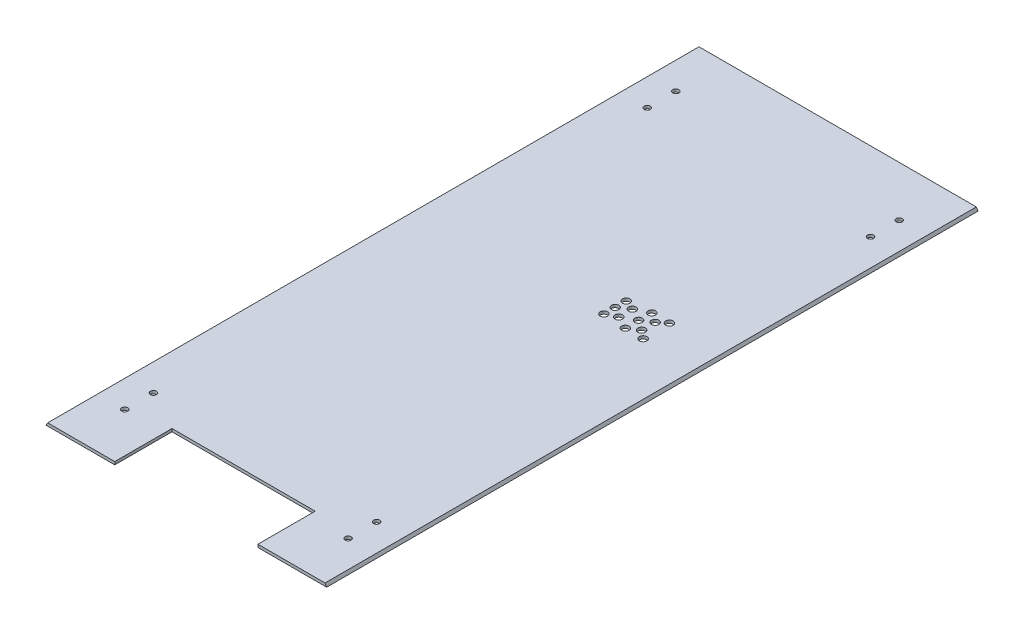
ISO-10303-21;
HEADER;
FILE_DESCRIPTION(('STEP AP214'),'2;1');
FILE_NAME('part.step','',(''),(''),'','','');
FILE_SCHEMA(('AUTOMOTIVE_DESIGN { 1 0 10303 214 1 1 1 1 }'));
ENDSEC;
DATA;
#1=APPLICATION_CONTEXT('core data for automotive mechanical design processes');
#2=APPLICATION_PROTOCOL_DEFINITION('international standard','automotive_design',2000,#1);
#3=PRODUCT_CONTEXT('',#1,'mechanical');
#4=PRODUCT('Part','Part','',(#3));
#5=PRODUCT_RELATED_PRODUCT_CATEGORY('part','',(#4));
#6=PRODUCT_DEFINITION_FORMATION('','',#4);
#7=PRODUCT_DEFINITION_CONTEXT('part definition',#1,'design');
#8=PRODUCT_DEFINITION('design','',#6,#7);
#9=PRODUCT_DEFINITION_SHAPE('','',#8);
#10=(LENGTH_UNIT() NAMED_UNIT(*) SI_UNIT(.MILLI.,.METRE.));
#11=(NAMED_UNIT(*) PLANE_ANGLE_UNIT() SI_UNIT($,.RADIAN.));
#12=(NAMED_UNIT(*) SI_UNIT($,.STERADIAN.) SOLID_ANGLE_UNIT());
#13=UNCERTAINTY_MEASURE_WITH_UNIT(LENGTH_MEASURE(1.E-05),#10,'distance_accuracy_value','');
#14=(GEOMETRIC_REPRESENTATION_CONTEXT(3) GLOBAL_UNCERTAINTY_ASSIGNED_CONTEXT((#13)) GLOBAL_UNIT_ASSIGNED_CONTEXT((#10,
#11,#12)) REPRESENTATION_CONTEXT('',''));
#15=CARTESIAN_POINT('',(0.,0.,0.));
#16=DIRECTION('',(0.,0.,1.));
#17=DIRECTION('',(1.,0.,0.));
#18=AXIS2_PLACEMENT_3D('',#15,#16,#17);
#19=CARTESIAN_POINT('',(0.,0.,0.));
#20=DIRECTION('',(0.,0.,1.));
#21=DIRECTION('',(1.,0.,0.));
#22=AXIS2_PLACEMENT_3D('',#19,#20,#21);
#23=PLANE('',#22);
#24=DIRECTION('',(0.,-1.,0.));
#25=VECTOR('',#24,1.);
#26=CARTESIAN_POINT('',(-49.965,1.,0.));
#27=LINE('',#26,#25);
#28=CARTESIAN_POINT('',(-49.965,1.,0.));
#29=VERTEX_POINT('',#28);
#30=CARTESIAN_POINT('',(-49.965,-1.,0.));
#31=VERTEX_POINT('',#30);
#32=EDGE_CURVE('E155',#29,#31,#27,.T.);
#33=ORIENTED_EDGE('',*,*,#32,.F.);
#34=DIRECTION('',(-1.,0.,0.));
#35=VECTOR('',#34,1.);
#36=CARTESIAN_POINT('',(-96.8452994616208,1.,0.));
#37=LINE('',#36,#35);
#38=CARTESIAN_POINT('',(-96.8452994616208,1.,0.));
#39=VERTEX_POINT('',#38);
#40=EDGE_CURVE('E143',#29,#39,#37,.T.);
#41=ORIENTED_EDGE('',*,*,#40,.T.);
#42=DIRECTION('',(-0.499999999999996,-0.866025403784441,0.));
#43=VECTOR('',#42,1.);
#44=CARTESIAN_POINT('',(-98.,-1.,0.));
#45=LINE('',#44,#43);
#46=CARTESIAN_POINT('',(-98.,-1.,0.));
#47=VERTEX_POINT('',#46);
#48=EDGE_CURVE('E229',#39,#47,#45,.T.);
#49=ORIENTED_EDGE('',*,*,#48,.T.);
#50=DIRECTION('',(1.,0.,0.));
#51=VECTOR('',#50,1.);
#52=CARTESIAN_POINT('',(-98.,-1.,0.));
#53=LINE('',#52,#51);
#54=EDGE_CURVE('E239',#47,#31,#53,.T.);
#55=ORIENTED_EDGE('',*,*,#54,.T.);
#56=EDGE_LOOP('',(#33,#41,#49,#55));
#57=FACE_BOUND('',#56,.T.);
#58=ADVANCED_FACE('F44',(#57),#23,.T.);
#59=CARTESIAN_POINT('',(-98.,-1.,-455.));
#60=DIRECTION('',(0.,-1.,0.));
#61=DIRECTION('',(0.,0.,-1.));
#62=AXIS2_PLACEMENT_3D('',#59,#60,#61);
#63=PLANE('',#62);
#64=CARTESIAN_POINT('',(31.5601459637591,-1.,-268.040513613342));
#65=DIRECTION('',(0.,-1.,0.));
#66=DIRECTION('',(0.,0.,-1.));
#67=AXIS2_PLACEMENT_3D('',#64,#65,#66);
#68=CIRCLE('',#67,2.60528257405916);
#69=CARTESIAN_POINT('',(31.5601459637591,-1.,-270.645796187401));
#70=VERTEX_POINT('',#69);
#71=EDGE_CURVE('E410',#70,#70,#68,.T.);
#72=ORIENTED_EDGE('',*,*,#71,.F.);
#73=EDGE_LOOP('',(#72));
#74=FACE_BOUND('',#73,.T.);
#75=CARTESIAN_POINT('',(31.5601459637591,-1.,-275.759418953796));
#76=DIRECTION('',(0.,-1.,0.));
#77=DIRECTION('',(0.,0.,-1.));
#78=AXIS2_PLACEMENT_3D('',#75,#76,#77);
#79=CIRCLE('',#78,2.60528257405916);
#80=CARTESIAN_POINT('',(31.5601459637591,-1.,-278.364701527855));
#81=VERTEX_POINT('',#80);
#82=EDGE_CURVE('E416',#81,#81,#79,.T.);
#83=ORIENTED_EDGE('',*,*,#82,.F.);
#84=EDGE_LOOP('',(#83));
#85=FACE_BOUND('',#84,.T.);
#86=CARTESIAN_POINT('',(38.5914315373827,-1.,-263.539657654421));
#87=DIRECTION('',(0.,-1.,0.));
#88=DIRECTION('',(0.,0.,-1.));
#89=AXIS2_PLACEMENT_3D('',#86,#87,#88);
#90=CIRCLE('',#89,2.60528257405916);
#91=CARTESIAN_POINT('',(38.5914315373827,-1.,-266.14494022848));
#92=VERTEX_POINT('',#91);
#93=EDGE_CURVE('E422',#92,#92,#90,.T.);
#94=ORIENTED_EDGE('',*,*,#93,.F.);
#95=EDGE_LOOP('',(#94));
#96=FACE_BOUND('',#95,.T.);
#97=CARTESIAN_POINT('',(38.5914315373827,-1.,-273.011612977402));
#98=DIRECTION('',(0.,-1.,0.));
#99=DIRECTION('',(0.,0.,-1.));
#100=AXIS2_PLACEMENT_3D('',#97,#98,#99);
#101=CIRCLE('',#100,2.60528257405916);
#102=CARTESIAN_POINT('',(38.5914315373827,-1.,-275.616895551461));
#103=VERTEX_POINT('',#102);
#104=EDGE_CURVE('E428',#103,#103,#101,.T.);
#105=ORIENTED_EDGE('',*,*,#104,.F.);
#106=EDGE_LOOP('',(#105));
#107=FACE_BOUND('',#106,.T.);
#108=CARTESIAN_POINT('',(47.6882599168788,-1.,-277.526130321409));
#109=DIRECTION('',(0.,-1.,0.));
#110=DIRECTION('',(0.,0.,-1.));
#111=AXIS2_PLACEMENT_3D('',#108,#109,#110);
#112=CIRCLE('',#111,2.60528257405916);
#113=CARTESIAN_POINT('',(47.6882599168788,-1.,-280.131412895469));
#114=VERTEX_POINT('',#113);
#115=EDGE_CURVE('E394',#114,#114,#112,.T.);
#116=ORIENTED_EDGE('',*,*,#115,.F.);
#117=EDGE_LOOP('',(#116));
#118=FACE_BOUND('',#117,.T.);
#119=CARTESIAN_POINT('',(54.5343266354687,-1.,-273.011612977402));
#120=DIRECTION('',(0.,-1.,0.));
#121=DIRECTION('',(0.,0.,-1.));
#122=AXIS2_PLACEMENT_3D('',#119,#120,#121);
#123=CIRCLE('',#122,2.60528257405916);
#124=CARTESIAN_POINT('',(54.5343266354687,-1.,-275.616895551461));
#125=VERTEX_POINT('',#124);
#126=EDGE_CURVE('E435',#125,#125,#123,.T.);
#127=ORIENTED_EDGE('',*,*,#126,.F.);
#128=EDGE_LOOP('',(#127));
#129=FACE_BOUND('',#128,.T.);
#130=CARTESIAN_POINT('',(54.5343266354687,-1.,-263.539657654421));
#131=DIRECTION('',(0.,-1.,0.));
#132=DIRECTION('',(0.,0.,-1.));
#133=AXIS2_PLACEMENT_3D('',#130,#131,#132);
#134=CIRCLE('',#133,2.60528257405916);
#135=CARTESIAN_POINT('',(54.5343266354687,-1.,-266.14494022848));
#136=VERTEX_POINT('',#135);
#137=EDGE_CURVE('E449',#136,#136,#134,.T.);
#138=ORIENTED_EDGE('',*,*,#137,.F.);
#139=EDGE_LOOP('',(#138));
#140=FACE_BOUND('',#139,.T.);
#141=CARTESIAN_POINT('',(47.5273903846532,-1.,-268.46949903261));
#142=DIRECTION('',(0.,-1.,0.));
#143=DIRECTION('',(0.,0.,-1.));
#144=AXIS2_PLACEMENT_3D('',#141,#142,#143);
#145=CIRCLE('',#144,2.60528257405916);
#146=CARTESIAN_POINT('',(47.5273903846532,-1.,-271.074781606669));
#147=VERTEX_POINT('',#146);
#148=EDGE_CURVE('E434',#147,#147,#145,.T.);
#149=ORIENTED_EDGE('',*,*,#148,.F.);
#150=EDGE_LOOP('',(#149));
#151=FACE_BOUND('',#150,.T.);
#152=CARTESIAN_POINT('',(47.6882599168788,-1.,-259.038134332609));
#153=DIRECTION('',(0.,-1.,0.));
#154=DIRECTION('',(0.,0.,-1.));
#155=AXIS2_PLACEMENT_3D('',#152,#153,#154);
#156=CIRCLE('',#155,2.60528257405916);
#157=CARTESIAN_POINT('',(47.6882599168788,-1.,-261.643416906668));
#158=VERTEX_POINT('',#157);
#159=EDGE_CURVE('E389',#158,#158,#156,.T.);
#160=ORIENTED_EDGE('',*,*,#159,.F.);
#161=EDGE_LOOP('',(#160));
#162=FACE_BOUND('',#161,.T.);
#163=CARTESIAN_POINT('',(60.3084004026386,-1.,-258.877264800383));
#164=DIRECTION('',(0.,-1.,0.));
#165=DIRECTION('',(0.,0.,-1.));
#166=AXIS2_PLACEMENT_3D('',#163,#164,#165);
#167=CIRCLE('',#166,2.60528257405916);
#168=CARTESIAN_POINT('',(60.3084004026386,-1.,-261.482547374442));
#169=VERTEX_POINT('',#168);
#170=EDGE_CURVE('E396',#169,#169,#167,.T.);
#171=ORIENTED_EDGE('',*,*,#170,.F.);
#172=EDGE_LOOP('',(#171));
#173=FACE_BOUND('',#172,.T.);
#174=CARTESIAN_POINT('',(59.9866613381874,-1.,-277.526130321409));
#175=DIRECTION('',(0.,-1.,0.));
#176=DIRECTION('',(0.,0.,-1.));
#177=AXIS2_PLACEMENT_3D('',#174,#175,#176);
#178=CIRCLE('',#177,2.60528257405916);
#179=CARTESIAN_POINT('',(59.9866613381874,-1.,-280.131412895469));
#180=VERTEX_POINT('',#179);
#181=EDGE_CURVE('E404',#180,#180,#178,.T.);
#182=ORIENTED_EDGE('',*,*,#181,.F.);
#183=EDGE_LOOP('',(#182));
#184=FACE_BOUND('',#183,.T.);
#185=CARTESIAN_POINT('',(31.5601459637591,-1.,-260.175968549482));
#186=DIRECTION('',(0.,-1.,0.));
#187=DIRECTION('',(0.,0.,-1.));
#188=AXIS2_PLACEMENT_3D('',#185,#186,#187);
#189=CIRCLE('',#188,2.60528257405916);
#190=CARTESIAN_POINT('',(31.5601459637591,-1.,-262.781251123542));
#191=VERTEX_POINT('',#190);
#192=EDGE_CURVE('E148',#191,#191,#189,.T.);
#193=ORIENTED_EDGE('',*,*,#192,.F.);
#194=EDGE_LOOP('',(#193));
#195=FACE_BOUND('',#194,.T.);
#196=DIRECTION('',(0.,0.,-1.));
#197=VECTOR('',#196,1.);
#198=CARTESIAN_POINT('',(-49.965,-1.,0.));
#199=LINE('',#198,#197);
#200=CARTESIAN_POINT('',(-49.965,-1.,-40.));
#201=VERTEX_POINT('',#200);
#202=EDGE_CURVE('E125',#31,#201,#199,.T.);
#203=ORIENTED_EDGE('',*,*,#202,.F.);
#204=ORIENTED_EDGE('',*,*,#54,.F.);
#205=DIRECTION('',(0.,0.,1.));
#206=VECTOR('',#205,1.);
#207=CARTESIAN_POINT('',(-98.,-1.,-455.));
#208=LINE('',#207,#206);
#209=CARTESIAN_POINT('',(-98.,-1.,-455.));
#210=VERTEX_POINT('',#209);
#211=EDGE_CURVE('E11',#210,#47,#208,.T.);
#212=ORIENTED_EDGE('',*,*,#211,.F.);
#213=DIRECTION('',(1.,0.,0.));
#214=VECTOR('',#213,1.);
#215=CARTESIAN_POINT('',(-98.,-1.,-455.));
#216=LINE('',#215,#214);
#217=CARTESIAN_POINT('',(98.07,-1.,-455.));
#218=VERTEX_POINT('',#217);
#219=EDGE_CURVE('E225',#210,#218,#216,.T.);
#220=ORIENTED_EDGE('',*,*,#219,.T.);
#221=DIRECTION('',(0.,0.,1.));
#222=VECTOR('',#221,1.);
#223=CARTESIAN_POINT('',(98.07,-1.,-455.));
#224=LINE('',#223,#222);
#225=CARTESIAN_POINT('',(98.07,-1.,0.));
#226=VERTEX_POINT('',#225);
#227=EDGE_CURVE('E48',#218,#226,#224,.T.);
#228=ORIENTED_EDGE('',*,*,#227,.T.);
#229=CARTESIAN_POINT('',(50.035,-1.,0.));
#230=VERTEX_POINT('',#229);
#231=EDGE_CURVE('E221',#230,#226,#53,.T.);
#232=ORIENTED_EDGE('',*,*,#231,.F.);
#233=DIRECTION('',(0.,0.,1.));
#234=VECTOR('',#233,1.);
#235=CARTESIAN_POINT('',(50.035,-1.,0.));
#236=LINE('',#235,#234);
#237=CARTESIAN_POINT('',(50.035,-1.,-40.));
#238=VERTEX_POINT('',#237);
#239=EDGE_CURVE('E62',#238,#230,#236,.T.);
#240=ORIENTED_EDGE('',*,*,#239,.F.);
#241=DIRECTION('',(1.,0.,0.));
#242=VECTOR('',#241,1.);
#243=CARTESIAN_POINT('',(-49.965,-1.,-40.));
#244=LINE('',#243,#242);
#245=EDGE_CURVE('E145',#201,#238,#244,.T.);
#246=ORIENTED_EDGE('',*,*,#245,.F.);
#247=EDGE_LOOP('',(#203,#204,#212,#220,#228,#232,#240,#246));
#248=FACE_BOUND('',#247,.T.);
#249=CARTESIAN_POINT('',(78.,-1.,-420.));
#250=DIRECTION('',(0.,-1.,0.));
#251=DIRECTION('',(0.,0.,-1.));
#252=AXIS2_PLACEMENT_3D('',#249,#250,#251);
#253=CIRCLE('',#252,2.1);
#254=CARTESIAN_POINT('',(78.,-1.,-422.1));
#255=VERTEX_POINT('',#254);
#256=EDGE_CURVE('E194',#255,#255,#253,.T.);
#257=ORIENTED_EDGE('',*,*,#256,.F.);
#258=EDGE_LOOP('',(#257));
#259=FACE_BOUND('',#258,.T.);
#260=CARTESIAN_POINT('',(78.,-1.,-35.));
#261=DIRECTION('',(0.,-1.,0.));
#262=DIRECTION('',(0.,0.,1.));
#263=AXIS2_PLACEMENT_3D('',#260,#261,#262);
#264=CIRCLE('',#263,2.1);
#265=CARTESIAN_POINT('',(78.,-1.,-32.9));
#266=VERTEX_POINT('',#265);
#267=EDGE_CURVE('E185',#266,#266,#264,.T.);
#268=ORIENTED_EDGE('',*,*,#267,.F.);
#269=EDGE_LOOP('',(#268));
#270=FACE_BOUND('',#269,.T.);
#271=CARTESIAN_POINT('',(78.,-1.,-55.));
#272=DIRECTION('',(0.,-1.,0.));
#273=DIRECTION('',(0.,0.,1.));
#274=AXIS2_PLACEMENT_3D('',#271,#272,#273);
#275=CIRCLE('',#274,2.1);
#276=CARTESIAN_POINT('',(78.,-1.,-52.9));
#277=VERTEX_POINT('',#276);
#278=EDGE_CURVE('E210',#277,#277,#275,.T.);
#279=ORIENTED_EDGE('',*,*,#278,.F.);
#280=EDGE_LOOP('',(#279));
#281=FACE_BOUND('',#280,.T.);
#282=CARTESIAN_POINT('',(-78.,-1.,-55.));
#283=DIRECTION('',(0.,-1.,0.));
#284=DIRECTION('',(0.,0.,-1.));
#285=AXIS2_PLACEMENT_3D('',#282,#283,#284);
#286=CIRCLE('',#285,2.1);
#287=CARTESIAN_POINT('',(-78.,-1.,-57.1));
#288=VERTEX_POINT('',#287);
#289=EDGE_CURVE('E201',#288,#288,#286,.T.);
#290=ORIENTED_EDGE('',*,*,#289,.F.);
#291=EDGE_LOOP('',(#290));
#292=FACE_BOUND('',#291,.T.);
#293=CARTESIAN_POINT('',(78.,-1.,-400.));
#294=DIRECTION('',(0.,-1.,0.));
#295=DIRECTION('',(0.,0.,-1.));
#296=AXIS2_PLACEMENT_3D('',#293,#294,#295);
#297=CIRCLE('',#296,2.1);
#298=CARTESIAN_POINT('',(78.,-1.,-402.1));
#299=VERTEX_POINT('',#298);
#300=EDGE_CURVE('E161',#299,#299,#297,.T.);
#301=ORIENTED_EDGE('',*,*,#300,.F.);
#302=EDGE_LOOP('',(#301));
#303=FACE_BOUND('',#302,.T.);
#304=CARTESIAN_POINT('',(-78.,-1.,-400.));
#305=DIRECTION('',(0.,-1.,0.));
#306=DIRECTION('',(0.,0.,1.));
#307=AXIS2_PLACEMENT_3D('',#304,#305,#306);
#308=CIRCLE('',#307,2.1);
#309=CARTESIAN_POINT('',(-78.,-1.,-397.9));
#310=VERTEX_POINT('',#309);
#311=EDGE_CURVE('E170',#310,#310,#308,.T.);
#312=ORIENTED_EDGE('',*,*,#311,.F.);
#313=EDGE_LOOP('',(#312));
#314=FACE_BOUND('',#313,.T.);
#315=CARTESIAN_POINT('',(-78.,-1.,-420.));
#316=DIRECTION('',(0.,-1.,0.));
#317=DIRECTION('',(0.,0.,1.));
#318=AXIS2_PLACEMENT_3D('',#315,#316,#317);
#319=CIRCLE('',#318,2.1);
#320=CARTESIAN_POINT('',(-78.,-1.,-417.9));
#321=VERTEX_POINT('',#320);
#322=EDGE_CURVE('E178',#321,#321,#319,.T.);
#323=ORIENTED_EDGE('',*,*,#322,.F.);
#324=EDGE_LOOP('',(#323));
#325=FACE_BOUND('',#324,.T.);
#326=CARTESIAN_POINT('',(-78.,-1.,-35.));
#327=DIRECTION('',(0.,-1.,0.));
#328=DIRECTION('',(0.,0.,-1.));
#329=AXIS2_PLACEMENT_3D('',#326,#327,#328);
#330=CIRCLE('',#329,2.1);
#331=CARTESIAN_POINT('',(-78.,-1.,-37.1));
#332=VERTEX_POINT('',#331);
#333=EDGE_CURVE('E205',#332,#332,#330,.T.);
#334=ORIENTED_EDGE('',*,*,#333,.F.);
#335=EDGE_LOOP('',(#334));
#336=FACE_BOUND('',#335,.T.);
#337=ADVANCED_FACE('F46',(#74,#85,#96,#107,#118,#129,#140,#151,#162,#173,#184,#195,#248,#259,
#270,#281,#292,#303,#314,#325,#336),#63,.T.);
#338=CARTESIAN_POINT('',(-98.,-1.,-455.));
#339=DIRECTION('',(-0.866025403784441,0.499999999999996,0.));
#340=DIRECTION('',(-0.499999999999996,-0.866025403784441,0.));
#341=AXIS2_PLACEMENT_3D('',#338,#339,#340);
#342=PLANE('',#341);
#343=ORIENTED_EDGE('',*,*,#48,.F.);
#344=DIRECTION('',(0.,0.,1.));
#345=VECTOR('',#344,1.);
#346=CARTESIAN_POINT('',(-96.8452994616208,1.,-455.));
#347=LINE('',#346,#345);
#348=CARTESIAN_POINT('',(-96.8452994616208,1.,-455.));
#349=VERTEX_POINT('',#348);
#350=EDGE_CURVE('E54',#349,#39,#347,.T.);
#351=ORIENTED_EDGE('',*,*,#350,.F.);
#352=DIRECTION('',(-0.499999999999996,-0.866025403784441,0.));
#353=VECTOR('',#352,1.);
#354=CARTESIAN_POINT('',(-98.,-1.,-455.));
#355=LINE('',#354,#353);
#356=EDGE_CURVE('E236',#349,#210,#355,.T.);
#357=ORIENTED_EDGE('',*,*,#356,.T.);
#358=ORIENTED_EDGE('',*,*,#211,.T.);
#359=EDGE_LOOP('',(#343,#351,#357,#358));
#360=FACE_BOUND('',#359,.T.);
#361=ADVANCED_FACE('F269',(#360),#342,.T.);
#362=CARTESIAN_POINT('',(-96.8452994616208,1.,-455.));
#363=DIRECTION('',(0.,1.,0.));
#364=DIRECTION('',(0.,0.,1.));
#365=AXIS2_PLACEMENT_3D('',#362,#363,#364);
#366=PLANE('',#365);
#367=CARTESIAN_POINT('',(31.5601459637591,1.,-268.040513613342));
#368=DIRECTION('',(0.,-1.,0.));
#369=DIRECTION('',(0.,0.,-1.));
#370=AXIS2_PLACEMENT_3D('',#367,#368,#369);
#371=CIRCLE('',#370,2.60528257405916);
#372=CARTESIAN_POINT('',(31.5601459637591,1.,-270.645796187401));
#373=VERTEX_POINT('',#372);
#374=EDGE_CURVE('E413',#373,#373,#371,.T.);
#375=ORIENTED_EDGE('',*,*,#374,.T.);
#376=EDGE_LOOP('',(#375));
#377=FACE_BOUND('',#376,.T.);
#378=CARTESIAN_POINT('',(31.5601459637591,1.,-275.759418953796));
#379=DIRECTION('',(0.,-1.,0.));
#380=DIRECTION('',(0.,0.,-1.));
#381=AXIS2_PLACEMENT_3D('',#378,#379,#380);
#382=CIRCLE('',#381,2.60528257405916);
#383=CARTESIAN_POINT('',(31.5601459637591,1.,-278.364701527855));
#384=VERTEX_POINT('',#383);
#385=EDGE_CURVE('E419',#384,#384,#382,.T.);
#386=ORIENTED_EDGE('',*,*,#385,.T.);
#387=EDGE_LOOP('',(#386));
#388=FACE_BOUND('',#387,.T.);
#389=CARTESIAN_POINT('',(38.5914315373827,1.,-263.539657654421));
#390=DIRECTION('',(0.,-1.,0.));
#391=DIRECTION('',(0.,0.,-1.));
#392=AXIS2_PLACEMENT_3D('',#389,#390,#391);
#393=CIRCLE('',#392,2.60528257405916);
#394=CARTESIAN_POINT('',(38.5914315373827,1.,-266.14494022848));
#395=VERTEX_POINT('',#394);
#396=EDGE_CURVE('E425',#395,#395,#393,.T.);
#397=ORIENTED_EDGE('',*,*,#396,.T.);
#398=EDGE_LOOP('',(#397));
#399=FACE_BOUND('',#398,.T.);
#400=CARTESIAN_POINT('',(38.5914315373827,1.,-273.011612977402));
#401=DIRECTION('',(0.,-1.,0.));
#402=DIRECTION('',(0.,0.,-1.));
#403=AXIS2_PLACEMENT_3D('',#400,#401,#402);
#404=CIRCLE('',#403,2.60528257405916);
#405=CARTESIAN_POINT('',(38.5914315373827,1.,-275.616895551461));
#406=VERTEX_POINT('',#405);
#407=EDGE_CURVE('E431',#406,#406,#404,.T.);
#408=ORIENTED_EDGE('',*,*,#407,.T.);
#409=EDGE_LOOP('',(#408));
#410=FACE_BOUND('',#409,.T.);
#411=CARTESIAN_POINT('',(47.6882599168788,1.,-277.526130321409));
#412=DIRECTION('',(0.,-1.,0.));
#413=DIRECTION('',(0.,0.,-1.));
#414=AXIS2_PLACEMENT_3D('',#411,#412,#413);
#415=CIRCLE('',#414,2.60528257405916);
#416=CARTESIAN_POINT('',(47.6882599168788,1.,-280.131412895469));
#417=VERTEX_POINT('',#416);
#418=EDGE_CURVE('E391',#417,#417,#415,.T.);
#419=ORIENTED_EDGE('',*,*,#418,.T.);
#420=EDGE_LOOP('',(#419));
#421=FACE_BOUND('',#420,.T.);
#422=CARTESIAN_POINT('',(54.5343266354687,1.,-273.011612977402));
#423=DIRECTION('',(0.,-1.,0.));
#424=DIRECTION('',(0.,0.,-1.));
#425=AXIS2_PLACEMENT_3D('',#422,#423,#424);
#426=CIRCLE('',#425,2.60528257405916);
#427=CARTESIAN_POINT('',(54.5343266354687,1.,-275.616895551461));
#428=VERTEX_POINT('',#427);
#429=EDGE_CURVE('E439',#428,#428,#426,.T.);
#430=ORIENTED_EDGE('',*,*,#429,.T.);
#431=EDGE_LOOP('',(#430));
#432=FACE_BOUND('',#431,.T.);
#433=CARTESIAN_POINT('',(54.5343266354687,1.,-263.539657654421));
#434=DIRECTION('',(0.,-1.,0.));
#435=DIRECTION('',(0.,0.,-1.));
#436=AXIS2_PLACEMENT_3D('',#433,#434,#435);
#437=CIRCLE('',#436,2.60528257405916);
#438=CARTESIAN_POINT('',(54.5343266354687,1.,-266.14494022848));
#439=VERTEX_POINT('',#438);
#440=EDGE_CURVE('E438',#439,#439,#437,.T.);
#441=ORIENTED_EDGE('',*,*,#440,.T.);
#442=EDGE_LOOP('',(#441));
#443=FACE_BOUND('',#442,.T.);
#444=CARTESIAN_POINT('',(47.5273903846532,1.,-268.46949903261));
#445=DIRECTION('',(0.,-1.,0.));
#446=DIRECTION('',(0.,0.,-1.));
#447=AXIS2_PLACEMENT_3D('',#444,#445,#446);
#448=CIRCLE('',#447,2.60528257405916);
#449=CARTESIAN_POINT('',(47.5273903846532,1.,-271.074781606669));
#450=VERTEX_POINT('',#449);
#451=EDGE_CURVE('E446',#450,#450,#448,.T.);
#452=ORIENTED_EDGE('',*,*,#451,.T.);
#453=EDGE_LOOP('',(#452));
#454=FACE_BOUND('',#453,.T.);
#455=CARTESIAN_POINT('',(47.6882599168788,1.,-259.038134332609));
#456=DIRECTION('',(0.,-1.,0.));
#457=DIRECTION('',(0.,0.,-1.));
#458=AXIS2_PLACEMENT_3D('',#455,#456,#457);
#459=CIRCLE('',#458,2.60528257405916);
#460=CARTESIAN_POINT('',(47.6882599168788,1.,-261.643416906668));
#461=VERTEX_POINT('',#460);
#462=EDGE_CURVE('E386',#461,#461,#459,.T.);
#463=ORIENTED_EDGE('',*,*,#462,.T.);
#464=EDGE_LOOP('',(#463));
#465=FACE_BOUND('',#464,.T.);
#466=CARTESIAN_POINT('',(60.3084004026386,1.,-258.877264800383));
#467=DIRECTION('',(0.,-1.,0.));
#468=DIRECTION('',(0.,0.,-1.));
#469=AXIS2_PLACEMENT_3D('',#466,#467,#468);
#470=CIRCLE('',#469,2.60528257405916);
#471=CARTESIAN_POINT('',(60.3084004026386,1.,-261.482547374442));
#472=VERTEX_POINT('',#471);
#473=EDGE_CURVE('E401',#472,#472,#470,.T.);
#474=ORIENTED_EDGE('',*,*,#473,.T.);
#475=EDGE_LOOP('',(#474));
#476=FACE_BOUND('',#475,.T.);
#477=CARTESIAN_POINT('',(59.9866613381874,1.,-277.526130321409));
#478=DIRECTION('',(0.,-1.,0.));
#479=DIRECTION('',(0.,0.,-1.));
#480=AXIS2_PLACEMENT_3D('',#477,#478,#479);
#481=CIRCLE('',#480,2.60528257405916);
#482=CARTESIAN_POINT('',(59.9866613381874,1.,-280.131412895469));
#483=VERTEX_POINT('',#482);
#484=EDGE_CURVE('E407',#483,#483,#481,.T.);
#485=ORIENTED_EDGE('',*,*,#484,.T.);
#486=EDGE_LOOP('',(#485));
#487=FACE_BOUND('',#486,.T.);
#488=CARTESIAN_POINT('',(31.5601459637591,1.,-260.175968549482));
#489=DIRECTION('',(0.,-1.,0.));
#490=DIRECTION('',(0.,0.,-1.));
#491=AXIS2_PLACEMENT_3D('',#488,#489,#490);
#492=CIRCLE('',#491,2.60528257405916);
#493=CARTESIAN_POINT('',(31.5601459637591,1.,-262.781251123542));
#494=VERTEX_POINT('',#493);
#495=EDGE_CURVE('E153',#494,#494,#492,.T.);
#496=ORIENTED_EDGE('',*,*,#495,.T.);
#497=EDGE_LOOP('',(#496));
#498=FACE_BOUND('',#497,.T.);
#499=DIRECTION('',(0.,0.,-1.));
#500=VECTOR('',#499,1.);
#501=CARTESIAN_POINT('',(-49.965,1.,0.));
#502=LINE('',#501,#500);
#503=CARTESIAN_POINT('',(-49.965,1.,-40.));
#504=VERTEX_POINT('',#503);
#505=EDGE_CURVE('E122',#29,#504,#502,.T.);
#506=ORIENTED_EDGE('',*,*,#505,.T.);
#507=DIRECTION('',(1.,0.,0.));
#508=VECTOR('',#507,1.);
#509=CARTESIAN_POINT('',(-49.965,1.,-40.));
#510=LINE('',#509,#508);
#511=CARTESIAN_POINT('',(50.035,1.,-40.));
#512=VERTEX_POINT('',#511);
#513=EDGE_CURVE('E133',#504,#512,#510,.T.);
#514=ORIENTED_EDGE('',*,*,#513,.T.);
#515=DIRECTION('',(0.,0.,1.));
#516=VECTOR('',#515,1.);
#517=CARTESIAN_POINT('',(50.035,1.,0.));
#518=LINE('',#517,#516);
#519=CARTESIAN_POINT('',(50.035,1.,0.));
#520=VERTEX_POINT('',#519);
#521=EDGE_CURVE('E130',#512,#520,#518,.T.);
#522=ORIENTED_EDGE('',*,*,#521,.T.);
#523=CARTESIAN_POINT('',(96.9152994616207,1.,0.));
#524=VERTEX_POINT('',#523);
#525=EDGE_CURVE('E247',#524,#520,#37,.T.);
#526=ORIENTED_EDGE('',*,*,#525,.F.);
#527=DIRECTION('',(0.,0.,1.));
#528=VECTOR('',#527,1.);
#529=CARTESIAN_POINT('',(96.9152994616207,1.,-455.));
#530=LINE('',#529,#528);
#531=CARTESIAN_POINT('',(96.9152994616207,1.,-455.));
#532=VERTEX_POINT('',#531);
#533=EDGE_CURVE('E255',#532,#524,#530,.T.);
#534=ORIENTED_EDGE('',*,*,#533,.F.);
#535=DIRECTION('',(-1.,0.,0.));
#536=VECTOR('',#535,1.);
#537=CARTESIAN_POINT('',(-96.8452994616208,1.,-455.));
#538=LINE('',#537,#536);
#539=EDGE_CURVE('E232',#532,#349,#538,.T.);
#540=ORIENTED_EDGE('',*,*,#539,.T.);
#541=ORIENTED_EDGE('',*,*,#350,.T.);
#542=ORIENTED_EDGE('',*,*,#40,.F.);
#543=EDGE_LOOP('',(#506,#514,#522,#526,#534,#540,#541,#542));
#544=FACE_BOUND('',#543,.T.);
#545=CARTESIAN_POINT('',(78.,1.,-420.));
#546=DIRECTION('',(0.,-1.,0.));
#547=DIRECTION('',(0.,0.,-1.));
#548=AXIS2_PLACEMENT_3D('',#545,#546,#547);
#549=CIRCLE('',#548,2.1);
#550=CARTESIAN_POINT('',(78.,1.,-422.1));
#551=VERTEX_POINT('',#550);
#552=EDGE_CURVE('E165',#551,#551,#549,.T.);
#553=ORIENTED_EDGE('',*,*,#552,.T.);
#554=EDGE_LOOP('',(#553));
#555=FACE_BOUND('',#554,.T.);
#556=CARTESIAN_POINT('',(78.,1.,-35.));
#557=DIRECTION('',(0.,-1.,0.));
#558=DIRECTION('',(0.,0.,1.));
#559=AXIS2_PLACEMENT_3D('',#556,#557,#558);
#560=CIRCLE('',#559,2.1);
#561=CARTESIAN_POINT('',(78.,1.,-32.9));
#562=VERTEX_POINT('',#561);
#563=EDGE_CURVE('E190',#562,#562,#560,.T.);
#564=ORIENTED_EDGE('',*,*,#563,.T.);
#565=EDGE_LOOP('',(#564));
#566=FACE_BOUND('',#565,.T.);
#567=CARTESIAN_POINT('',(78.,1.,-55.));
#568=DIRECTION('',(0.,-1.,0.));
#569=DIRECTION('',(0.,0.,1.));
#570=AXIS2_PLACEMENT_3D('',#567,#568,#569);
#571=CIRCLE('',#570,2.1);
#572=CARTESIAN_POINT('',(78.,1.,-52.9));
#573=VERTEX_POINT('',#572);
#574=EDGE_CURVE('E189',#573,#573,#571,.T.);
#575=ORIENTED_EDGE('',*,*,#574,.T.);
#576=EDGE_LOOP('',(#575));
#577=FACE_BOUND('',#576,.T.);
#578=CARTESIAN_POINT('',(-78.,1.,-55.));
#579=DIRECTION('',(0.,-1.,0.));
#580=DIRECTION('',(0.,0.,-1.));
#581=AXIS2_PLACEMENT_3D('',#578,#579,#580);
#582=CIRCLE('',#581,2.1);
#583=CARTESIAN_POINT('',(-78.,1.,-57.1));
#584=VERTEX_POINT('',#583);
#585=EDGE_CURVE('E206',#584,#584,#582,.T.);
#586=ORIENTED_EDGE('',*,*,#585,.T.);
#587=EDGE_LOOP('',(#586));
#588=FACE_BOUND('',#587,.T.);
#589=CARTESIAN_POINT('',(78.,1.,-400.));
#590=DIRECTION('',(0.,-1.,0.));
#591=DIRECTION('',(0.,0.,-1.));
#592=AXIS2_PLACEMENT_3D('',#589,#590,#591);
#593=CIRCLE('',#592,2.1);
#594=CARTESIAN_POINT('',(78.,1.,-402.1));
#595=VERTEX_POINT('',#594);
#596=EDGE_CURVE('E166',#595,#595,#593,.T.);
#597=ORIENTED_EDGE('',*,*,#596,.T.);
#598=EDGE_LOOP('',(#597));
#599=FACE_BOUND('',#598,.T.);
#600=CARTESIAN_POINT('',(-78.,1.,-400.));
#601=DIRECTION('',(0.,-1.,0.));
#602=DIRECTION('',(0.,0.,1.));
#603=AXIS2_PLACEMENT_3D('',#600,#601,#602);
#604=CIRCLE('',#603,2.1);
#605=CARTESIAN_POINT('',(-78.,1.,-397.9));
#606=VERTEX_POINT('',#605);
#607=EDGE_CURVE('E174',#606,#606,#604,.T.);
#608=ORIENTED_EDGE('',*,*,#607,.T.);
#609=EDGE_LOOP('',(#608));
#610=FACE_BOUND('',#609,.T.);
#611=CARTESIAN_POINT('',(-78.,1.,-420.));
#612=DIRECTION('',(0.,-1.,0.));
#613=DIRECTION('',(0.,0.,1.));
#614=AXIS2_PLACEMENT_3D('',#611,#612,#613);
#615=CIRCLE('',#614,2.1);
#616=CARTESIAN_POINT('',(-78.,1.,-417.9));
#617=VERTEX_POINT('',#616);
#618=EDGE_CURVE('E157',#617,#617,#615,.T.);
#619=ORIENTED_EDGE('',*,*,#618,.T.);
#620=EDGE_LOOP('',(#619));
#621=FACE_BOUND('',#620,.T.);
#622=CARTESIAN_POINT('',(-78.,1.,-35.));
#623=DIRECTION('',(0.,-1.,0.));
#624=DIRECTION('',(0.,0.,-1.));
#625=AXIS2_PLACEMENT_3D('',#622,#623,#624);
#626=CIRCLE('',#625,2.1);
#627=CARTESIAN_POINT('',(-78.,1.,-37.1));
#628=VERTEX_POINT('',#627);
#629=EDGE_CURVE('E217',#628,#628,#626,.T.);
#630=ORIENTED_EDGE('',*,*,#629,.T.);
#631=EDGE_LOOP('',(#630));
#632=FACE_BOUND('',#631,.T.);
#633=ADVANCED_FACE('F140',(#377,#388,#399,#410,#421,#432,#443,#454,#465,#476,#487,#498,#544,
#555,#566,#577,#588,#599,#610,#621,#632),#366,.T.);
#634=CARTESIAN_POINT('',(98.07,-1.,-455.));
#635=DIRECTION('',(0.866025403784441,0.499999999999996,0.));
#636=DIRECTION('',(-0.499999999999996,0.866025403784441,0.));
#637=AXIS2_PLACEMENT_3D('',#634,#635,#636);
#638=PLANE('',#637);
#639=DIRECTION('',(-0.499999999999996,0.866025403784441,0.));
#640=VECTOR('',#639,1.);
#641=CARTESIAN_POINT('',(98.07,-1.,0.));
#642=LINE('',#641,#640);
#643=EDGE_CURVE('E243',#226,#524,#642,.T.);
#644=ORIENTED_EDGE('',*,*,#643,.F.);
#645=ORIENTED_EDGE('',*,*,#227,.F.);
#646=DIRECTION('',(-0.499999999999996,0.866025403784441,0.));
#647=VECTOR('',#646,1.);
#648=CARTESIAN_POINT('',(98.07,-1.,-455.));
#649=LINE('',#648,#647);
#650=EDGE_CURVE('E228',#218,#532,#649,.T.);
#651=ORIENTED_EDGE('',*,*,#650,.T.);
#652=ORIENTED_EDGE('',*,*,#533,.T.);
#653=EDGE_LOOP('',(#644,#645,#651,#652));
#654=FACE_BOUND('',#653,.T.);
#655=ADVANCED_FACE('F261',(#654),#638,.T.);
#656=CARTESIAN_POINT('',(0.,0.,-455.));
#657=DIRECTION('',(0.,0.,1.));
#658=DIRECTION('',(1.,0.,0.));
#659=AXIS2_PLACEMENT_3D('',#656,#657,#658);
#660=PLANE('',#659);
#661=ORIENTED_EDGE('',*,*,#219,.F.);
#662=ORIENTED_EDGE('',*,*,#356,.F.);
#663=ORIENTED_EDGE('',*,*,#539,.F.);
#664=ORIENTED_EDGE('',*,*,#650,.F.);
#665=EDGE_LOOP('',(#661,#662,#663,#664));
#666=FACE_BOUND('',#665,.T.);
#667=ADVANCED_FACE('F288',(#666),#660,.F.);
#668=DIRECTION('',(0.,-1.,0.));
#669=VECTOR('',#668,1.);
#670=CARTESIAN_POINT('',(50.035,1.,0.));
#671=LINE('',#670,#669);
#672=EDGE_CURVE('E158',#520,#230,#671,.T.);
#673=ORIENTED_EDGE('',*,*,#672,.T.);
#674=ORIENTED_EDGE('',*,*,#231,.T.);
#675=ORIENTED_EDGE('',*,*,#643,.T.);
#676=ORIENTED_EDGE('',*,*,#525,.T.);
#677=EDGE_LOOP('',(#673,#674,#675,#676));
#678=FACE_BOUND('',#677,.T.);
#679=ADVANCED_FACE('F263',(#678),#23,.T.);
#680=CARTESIAN_POINT('',(-78.,1.,-35.));
#681=DIRECTION('',(0.,-1.,0.));
#682=DIRECTION('',(0.,0.,-1.));
#683=AXIS2_PLACEMENT_3D('',#680,#681,#682);
#684=CYLINDRICAL_SURFACE('',#683,2.1);
#685=ORIENTED_EDGE('',*,*,#629,.F.);
#686=EDGE_LOOP('',(#685));
#687=FACE_BOUND('',#686,.T.);
#688=ORIENTED_EDGE('',*,*,#333,.T.);
#689=EDGE_LOOP('',(#688));
#690=FACE_BOUND('',#689,.T.);
#691=ADVANCED_FACE('F287',(#687,#690),#684,.F.);
#692=CARTESIAN_POINT('',(-78.,1.,-420.));
#693=DIRECTION('',(0.,-1.,0.));
#694=DIRECTION('',(0.,0.,-1.));
#695=AXIS2_PLACEMENT_3D('',#692,#693,#694);
#696=CYLINDRICAL_SURFACE('',#695,2.1);
#697=ORIENTED_EDGE('',*,*,#618,.F.);
#698=EDGE_LOOP('',(#697));
#699=FACE_BOUND('',#698,.T.);
#700=ORIENTED_EDGE('',*,*,#322,.T.);
#701=EDGE_LOOP('',(#700));
#702=FACE_BOUND('',#701,.T.);
#703=ADVANCED_FACE('F293',(#699,#702),#696,.F.);
#704=CARTESIAN_POINT('',(-78.,1.,-400.));
#705=DIRECTION('',(0.,-1.,0.));
#706=DIRECTION('',(0.,0.,-1.));
#707=AXIS2_PLACEMENT_3D('',#704,#705,#706);
#708=CYLINDRICAL_SURFACE('',#707,2.1);
#709=ORIENTED_EDGE('',*,*,#607,.F.);
#710=EDGE_LOOP('',(#709));
#711=FACE_BOUND('',#710,.T.);
#712=ORIENTED_EDGE('',*,*,#311,.T.);
#713=EDGE_LOOP('',(#712));
#714=FACE_BOUND('',#713,.T.);
#715=ADVANCED_FACE('F320',(#711,#714),#708,.F.);
#716=CARTESIAN_POINT('',(78.,1.,-400.));
#717=DIRECTION('',(0.,-1.,0.));
#718=DIRECTION('',(0.,0.,-1.));
#719=AXIS2_PLACEMENT_3D('',#716,#717,#718);
#720=CYLINDRICAL_SURFACE('',#719,2.1);
#721=ORIENTED_EDGE('',*,*,#596,.F.);
#722=EDGE_LOOP('',(#721));
#723=FACE_BOUND('',#722,.T.);
#724=ORIENTED_EDGE('',*,*,#300,.T.);
#725=EDGE_LOOP('',(#724));
#726=FACE_BOUND('',#725,.T.);
#727=ADVANCED_FACE('F309',(#723,#726),#720,.F.);
#728=CARTESIAN_POINT('',(-78.,1.,-55.));
#729=DIRECTION('',(0.,-1.,0.));
#730=DIRECTION('',(0.,0.,-1.));
#731=AXIS2_PLACEMENT_3D('',#728,#729,#730);
#732=CYLINDRICAL_SURFACE('',#731,2.1);
#733=ORIENTED_EDGE('',*,*,#585,.F.);
#734=EDGE_LOOP('',(#733));
#735=FACE_BOUND('',#734,.T.);
#736=ORIENTED_EDGE('',*,*,#289,.T.);
#737=EDGE_LOOP('',(#736));
#738=FACE_BOUND('',#737,.T.);
#739=ADVANCED_FACE('F305',(#735,#738),#732,.F.);
#740=CARTESIAN_POINT('',(78.,1.,-55.));
#741=DIRECTION('',(0.,-1.,0.));
#742=DIRECTION('',(0.,0.,-1.));
#743=AXIS2_PLACEMENT_3D('',#740,#741,#742);
#744=CYLINDRICAL_SURFACE('',#743,2.1);
#745=ORIENTED_EDGE('',*,*,#574,.F.);
#746=EDGE_LOOP('',(#745));
#747=FACE_BOUND('',#746,.T.);
#748=ORIENTED_EDGE('',*,*,#278,.T.);
#749=EDGE_LOOP('',(#748));
#750=FACE_BOUND('',#749,.T.);
#751=ADVANCED_FACE('F301',(#747,#750),#744,.F.);
#752=CARTESIAN_POINT('',(78.,1.,-35.));
#753=DIRECTION('',(0.,-1.,0.));
#754=DIRECTION('',(0.,0.,-1.));
#755=AXIS2_PLACEMENT_3D('',#752,#753,#754);
#756=CYLINDRICAL_SURFACE('',#755,2.1);
#757=ORIENTED_EDGE('',*,*,#563,.F.);
#758=EDGE_LOOP('',(#757));
#759=FACE_BOUND('',#758,.T.);
#760=ORIENTED_EDGE('',*,*,#267,.T.);
#761=EDGE_LOOP('',(#760));
#762=FACE_BOUND('',#761,.T.);
#763=ADVANCED_FACE('F304',(#759,#762),#756,.F.);
#764=CARTESIAN_POINT('',(78.,1.,-420.));
#765=DIRECTION('',(0.,-1.,0.));
#766=DIRECTION('',(0.,0.,-1.));
#767=AXIS2_PLACEMENT_3D('',#764,#765,#766);
#768=CYLINDRICAL_SURFACE('',#767,2.1);
#769=ORIENTED_EDGE('',*,*,#552,.F.);
#770=EDGE_LOOP('',(#769));
#771=FACE_BOUND('',#770,.T.);
#772=ORIENTED_EDGE('',*,*,#256,.T.);
#773=EDGE_LOOP('',(#772));
#774=FACE_BOUND('',#773,.T.);
#775=ADVANCED_FACE('F311',(#771,#774),#768,.F.);
#776=CARTESIAN_POINT('',(-49.965,1.,0.));
#777=DIRECTION('',(-1.,0.,0.));
#778=DIRECTION('',(0.,0.,1.));
#779=AXIS2_PLACEMENT_3D('',#776,#777,#778);
#780=PLANE('',#779);
#781=ORIENTED_EDGE('',*,*,#202,.T.);
#782=DIRECTION('',(0.,-1.,0.));
#783=VECTOR('',#782,1.);
#784=CARTESIAN_POINT('',(-49.965,1.,-40.));
#785=LINE('',#784,#783);
#786=EDGE_CURVE('E118',#504,#201,#785,.T.);
#787=ORIENTED_EDGE('',*,*,#786,.F.);
#788=ORIENTED_EDGE('',*,*,#505,.F.);
#789=ORIENTED_EDGE('',*,*,#32,.T.);
#790=EDGE_LOOP('',(#781,#787,#788,#789));
#791=FACE_BOUND('',#790,.T.);
#792=ADVANCED_FACE('F120',(#791),#780,.F.);
#793=CARTESIAN_POINT('',(50.035,1.,0.));
#794=DIRECTION('',(1.,0.,0.));
#795=DIRECTION('',(0.,0.,-1.));
#796=AXIS2_PLACEMENT_3D('',#793,#794,#795);
#797=PLANE('',#796);
#798=ORIENTED_EDGE('',*,*,#239,.T.);
#799=ORIENTED_EDGE('',*,*,#672,.F.);
#800=ORIENTED_EDGE('',*,*,#521,.F.);
#801=DIRECTION('',(0.,-1.,0.));
#802=VECTOR('',#801,1.);
#803=CARTESIAN_POINT('',(50.035,1.,-40.));
#804=LINE('',#803,#802);
#805=EDGE_CURVE('E129',#512,#238,#804,.T.);
#806=ORIENTED_EDGE('',*,*,#805,.T.);
#807=EDGE_LOOP('',(#798,#799,#800,#806));
#808=FACE_BOUND('',#807,.T.);
#809=ADVANCED_FACE('F329',(#808),#797,.F.);
#810=CARTESIAN_POINT('',(-49.965,1.,-40.));
#811=DIRECTION('',(0.,0.,-1.));
#812=DIRECTION('',(-1.,0.,0.));
#813=AXIS2_PLACEMENT_3D('',#810,#811,#812);
#814=PLANE('',#813);
#815=ORIENTED_EDGE('',*,*,#245,.T.);
#816=ORIENTED_EDGE('',*,*,#805,.F.);
#817=ORIENTED_EDGE('',*,*,#513,.F.);
#818=ORIENTED_EDGE('',*,*,#786,.T.);
#819=EDGE_LOOP('',(#815,#816,#817,#818));
#820=FACE_BOUND('',#819,.T.);
#821=ADVANCED_FACE('F134',(#820),#814,.F.);
#822=CARTESIAN_POINT('',(31.5601459637591,1.,-260.175968549482));
#823=DIRECTION('',(0.,-1.,0.));
#824=DIRECTION('',(0.,0.,-1.));
#825=AXIS2_PLACEMENT_3D('',#822,#823,#824);
#826=CYLINDRICAL_SURFACE('',#825,2.60528257405916);
#827=ORIENTED_EDGE('',*,*,#495,.F.);
#828=EDGE_LOOP('',(#827));
#829=FACE_BOUND('',#828,.T.);
#830=ORIENTED_EDGE('',*,*,#192,.T.);
#831=EDGE_LOOP('',(#830));
#832=FACE_BOUND('',#831,.T.);
#833=ADVANCED_FACE('F332',(#829,#832),#826,.F.);
#834=CARTESIAN_POINT('',(59.9866613381874,1.,-277.526130321409));
#835=DIRECTION('',(0.,-1.,0.));
#836=DIRECTION('',(0.,0.,-1.));
#837=AXIS2_PLACEMENT_3D('',#834,#835,#836);
#838=CYLINDRICAL_SURFACE('',#837,2.60528257405916);
#839=ORIENTED_EDGE('',*,*,#484,.F.);
#840=EDGE_LOOP('',(#839));
#841=FACE_BOUND('',#840,.T.);
#842=ORIENTED_EDGE('',*,*,#181,.T.);
#843=EDGE_LOOP('',(#842));
#844=FACE_BOUND('',#843,.T.);
#845=ADVANCED_FACE('F337',(#841,#844),#838,.F.);
#846=CARTESIAN_POINT('',(60.3084004026386,1.,-258.877264800383));
#847=DIRECTION('',(0.,-1.,0.));
#848=DIRECTION('',(0.,0.,-1.));
#849=AXIS2_PLACEMENT_3D('',#846,#847,#848);
#850=CYLINDRICAL_SURFACE('',#849,2.60528257405916);
#851=ORIENTED_EDGE('',*,*,#473,.F.);
#852=EDGE_LOOP('',(#851));
#853=FACE_BOUND('',#852,.T.);
#854=ORIENTED_EDGE('',*,*,#170,.T.);
#855=EDGE_LOOP('',(#854));
#856=FACE_BOUND('',#855,.T.);
#857=ADVANCED_FACE('F374',(#853,#856),#850,.F.);
#858=CARTESIAN_POINT('',(47.6882599168788,1.,-259.038134332609));
#859=DIRECTION('',(0.,-1.,0.));
#860=DIRECTION('',(0.,0.,-1.));
#861=AXIS2_PLACEMENT_3D('',#858,#859,#860);
#862=CYLINDRICAL_SURFACE('',#861,2.60528257405916);
#863=ORIENTED_EDGE('',*,*,#462,.F.);
#864=EDGE_LOOP('',(#863));
#865=FACE_BOUND('',#864,.T.);
#866=ORIENTED_EDGE('',*,*,#159,.T.);
#867=EDGE_LOOP('',(#866));
#868=FACE_BOUND('',#867,.T.);
#869=ADVANCED_FACE('F347',(#865,#868),#862,.F.);
#870=CARTESIAN_POINT('',(47.5273903846532,1.,-268.46949903261));
#871=DIRECTION('',(0.,-1.,0.));
#872=DIRECTION('',(0.,0.,-1.));
#873=AXIS2_PLACEMENT_3D('',#870,#871,#872);
#874=CYLINDRICAL_SURFACE('',#873,2.60528257405916);
#875=ORIENTED_EDGE('',*,*,#451,.F.);
#876=EDGE_LOOP('',(#875));
#877=FACE_BOUND('',#876,.T.);
#878=ORIENTED_EDGE('',*,*,#148,.T.);
#879=EDGE_LOOP('',(#878));
#880=FACE_BOUND('',#879,.T.);
#881=ADVANCED_FACE('F343',(#877,#880),#874,.F.);
#882=CARTESIAN_POINT('',(54.5343266354687,1.,-263.539657654421));
#883=DIRECTION('',(0.,-1.,0.));
#884=DIRECTION('',(0.,0.,-1.));
#885=AXIS2_PLACEMENT_3D('',#882,#883,#884);
#886=CYLINDRICAL_SURFACE('',#885,2.60528257405916);
#887=ORIENTED_EDGE('',*,*,#440,.F.);
#888=EDGE_LOOP('',(#887));
#889=FACE_BOUND('',#888,.T.);
#890=ORIENTED_EDGE('',*,*,#137,.T.);
#891=EDGE_LOOP('',(#890));
#892=FACE_BOUND('',#891,.T.);
#893=ADVANCED_FACE('F339',(#889,#892),#886,.F.);
#894=CARTESIAN_POINT('',(54.5343266354687,1.,-273.011612977402));
#895=DIRECTION('',(0.,-1.,0.));
#896=DIRECTION('',(0.,0.,-1.));
#897=AXIS2_PLACEMENT_3D('',#894,#895,#896);
#898=CYLINDRICAL_SURFACE('',#897,2.60528257405916);
#899=ORIENTED_EDGE('',*,*,#429,.F.);
#900=EDGE_LOOP('',(#899));
#901=FACE_BOUND('',#900,.T.);
#902=ORIENTED_EDGE('',*,*,#126,.T.);
#903=EDGE_LOOP('',(#902));
#904=FACE_BOUND('',#903,.T.);
#905=ADVANCED_FACE('F342',(#901,#904),#898,.F.);
#906=CARTESIAN_POINT('',(47.6882599168788,1.,-277.526130321409));
#907=DIRECTION('',(0.,-1.,0.));
#908=DIRECTION('',(0.,0.,-1.));
#909=AXIS2_PLACEMENT_3D('',#906,#907,#908);
#910=CYLINDRICAL_SURFACE('',#909,2.60528257405916);
#911=ORIENTED_EDGE('',*,*,#418,.F.);
#912=EDGE_LOOP('',(#911));
#913=FACE_BOUND('',#912,.T.);
#914=ORIENTED_EDGE('',*,*,#115,.T.);
#915=EDGE_LOOP('',(#914));
#916=FACE_BOUND('',#915,.T.);
#917=ADVANCED_FACE('F349',(#913,#916),#910,.F.);
#918=CARTESIAN_POINT('',(38.5914315373827,1.,-273.011612977402));
#919=DIRECTION('',(0.,-1.,0.));
#920=DIRECTION('',(0.,0.,-1.));
#921=AXIS2_PLACEMENT_3D('',#918,#919,#920);
#922=CYLINDRICAL_SURFACE('',#921,2.60528257405916);
#923=ORIENTED_EDGE('',*,*,#407,.F.);
#924=EDGE_LOOP('',(#923));
#925=FACE_BOUND('',#924,.T.);
#926=ORIENTED_EDGE('',*,*,#104,.T.);
#927=EDGE_LOOP('',(#926));
#928=FACE_BOUND('',#927,.T.);
#929=ADVANCED_FACE('F352',(#925,#928),#922,.F.);
#930=CARTESIAN_POINT('',(38.5914315373827,1.,-263.539657654421));
#931=DIRECTION('',(0.,-1.,0.));
#932=DIRECTION('',(0.,0.,-1.));
#933=AXIS2_PLACEMENT_3D('',#930,#931,#932);
#934=CYLINDRICAL_SURFACE('',#933,2.60528257405916);
#935=ORIENTED_EDGE('',*,*,#396,.F.);
#936=EDGE_LOOP('',(#935));
#937=FACE_BOUND('',#936,.T.);
#938=ORIENTED_EDGE('',*,*,#93,.T.);
#939=EDGE_LOOP('',(#938));
#940=FACE_BOUND('',#939,.T.);
#941=ADVANCED_FACE('F359',(#937,#940),#934,.F.);
#942=CARTESIAN_POINT('',(31.5601459637591,1.,-275.759418953796));
#943=DIRECTION('',(0.,-1.,0.));
#944=DIRECTION('',(0.,0.,-1.));
#945=AXIS2_PLACEMENT_3D('',#942,#943,#944);
#946=CYLINDRICAL_SURFACE('',#945,2.60528257405916);
#947=ORIENTED_EDGE('',*,*,#385,.F.);
#948=EDGE_LOOP('',(#947));
#949=FACE_BOUND('',#948,.T.);
#950=ORIENTED_EDGE('',*,*,#82,.T.);
#951=EDGE_LOOP('',(#950));
#952=FACE_BOUND('',#951,.T.);
#953=ADVANCED_FACE('F363',(#949,#952),#946,.F.);
#954=CARTESIAN_POINT('',(31.5601459637591,1.,-268.040513613342));
#955=DIRECTION('',(0.,-1.,0.));
#956=DIRECTION('',(0.,0.,-1.));
#957=AXIS2_PLACEMENT_3D('',#954,#955,#956);
#958=CYLINDRICAL_SURFACE('',#957,2.60528257405916);
#959=ORIENTED_EDGE('',*,*,#374,.F.);
#960=EDGE_LOOP('',(#959));
#961=FACE_BOUND('',#960,.T.);
#962=ORIENTED_EDGE('',*,*,#71,.T.);
#963=EDGE_LOOP('',(#962));
#964=FACE_BOUND('',#963,.T.);
#965=ADVANCED_FACE('F367',(#961,#964),#958,.F.);
#966=CLOSED_SHELL('',(#58,#337,#361,#633,#655,#667,#679,#691,#703,#715,#727,#739,#751,#763,#775,
#792,#809,#821,#833,#845,#857,#869,#881,#893,#905,#917,#929,#941,#953,#965));
#967=MANIFOLD_SOLID_BREP('B2',#966);
#968=ADVANCED_BREP_SHAPE_REPRESENTATION('',(#18,#967),#14);
#969=SHAPE_DEFINITION_REPRESENTATION(#9,#968);
ENDSEC;
END-ISO-10303-21;
